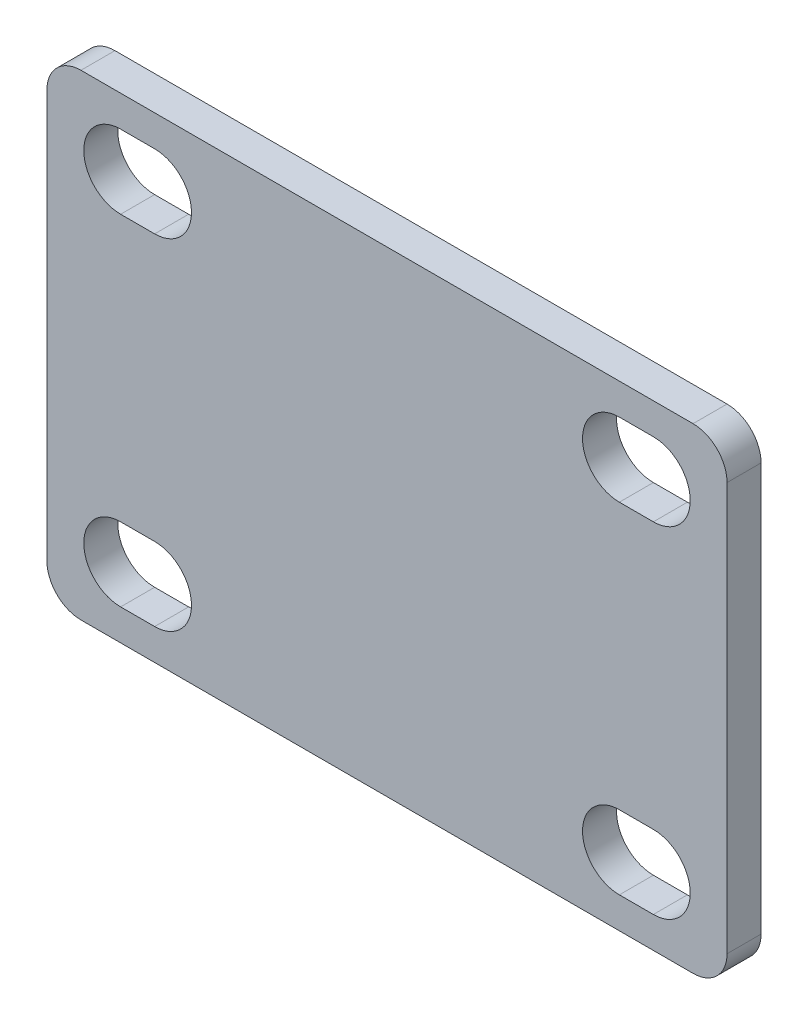
ISO-10303-21;
HEADER;
FILE_DESCRIPTION(('STEP AP214'),'2;1');
FILE_NAME('part.step','',(''),(''),'','','');
FILE_SCHEMA(('AUTOMOTIVE_DESIGN { 1 0 10303 214 1 1 1 1 }'));
ENDSEC;
DATA;
#1=APPLICATION_CONTEXT('core data for automotive mechanical design processes');
#2=APPLICATION_PROTOCOL_DEFINITION('international standard','automotive_design',2000,#1);
#3=PRODUCT_CONTEXT('',#1,'mechanical');
#4=PRODUCT('Part','Part','',(#3));
#5=PRODUCT_RELATED_PRODUCT_CATEGORY('part','',(#4));
#6=PRODUCT_DEFINITION_FORMATION('','',#4);
#7=PRODUCT_DEFINITION_CONTEXT('part definition',#1,'design');
#8=PRODUCT_DEFINITION('design','',#6,#7);
#9=PRODUCT_DEFINITION_SHAPE('','',#8);
#10=(LENGTH_UNIT() NAMED_UNIT(*) SI_UNIT(.MILLI.,.METRE.));
#11=(NAMED_UNIT(*) PLANE_ANGLE_UNIT() SI_UNIT($,.RADIAN.));
#12=(NAMED_UNIT(*) SI_UNIT($,.STERADIAN.) SOLID_ANGLE_UNIT());
#13=UNCERTAINTY_MEASURE_WITH_UNIT(LENGTH_MEASURE(1.E-05),#10,'distance_accuracy_value','');
#14=(GEOMETRIC_REPRESENTATION_CONTEXT(3) GLOBAL_UNCERTAINTY_ASSIGNED_CONTEXT((#13)) GLOBAL_UNIT_ASSIGNED_CONTEXT((#10,
#11,#12)) REPRESENTATION_CONTEXT('',''));
#15=CARTESIAN_POINT('',(0.,0.,0.));
#16=DIRECTION('',(0.,0.,1.));
#17=DIRECTION('',(1.,0.,0.));
#18=AXIS2_PLACEMENT_3D('',#15,#16,#17);
#19=CARTESIAN_POINT('',(-30.,21.,3.));
#20=DIRECTION('',(1.,0.,0.));
#21=DIRECTION('',(0.,1.,0.));
#22=AXIS2_PLACEMENT_3D('',#19,#20,#21);
#23=PLANE('',#22);
#24=DIRECTION('',(0.,-1.,0.));
#25=VECTOR('',#24,1.);
#26=CARTESIAN_POINT('',(-30.,21.,3.));
#27=LINE('',#26,#25);
#28=CARTESIAN_POINT('',(-30.,18.,3.));
#29=VERTEX_POINT('',#28);
#30=CARTESIAN_POINT('',(-30.,-18.,3.));
#31=VERTEX_POINT('',#30);
#32=EDGE_CURVE('E388',#29,#31,#27,.T.);
#33=ORIENTED_EDGE('',*,*,#32,.F.);
#34=DIRECTION('',(0.,0.,-1.));
#35=VECTOR('',#34,1.);
#36=CARTESIAN_POINT('',(-30.,18.,3.));
#37=LINE('',#36,#35);
#38=CARTESIAN_POINT('',(-30.,18.,0.));
#39=VERTEX_POINT('',#38);
#40=EDGE_CURVE('E419',#29,#39,#37,.T.);
#41=ORIENTED_EDGE('',*,*,#40,.T.);
#42=DIRECTION('',(0.,-1.,0.));
#43=VECTOR('',#42,1.);
#44=CARTESIAN_POINT('',(-30.,21.,0.));
#45=LINE('',#44,#43);
#46=CARTESIAN_POINT('',(-30.,-18.,0.));
#47=VERTEX_POINT('',#46);
#48=EDGE_CURVE('E378',#39,#47,#45,.T.);
#49=ORIENTED_EDGE('',*,*,#48,.T.);
#50=DIRECTION('',(0.,0.,-1.));
#51=VECTOR('',#50,1.);
#52=CARTESIAN_POINT('',(-30.,-18.,3.));
#53=LINE('',#52,#51);
#54=EDGE_CURVE('E403',#47,#31,#53,.F.);
#55=ORIENTED_EDGE('',*,*,#54,.T.);
#56=EDGE_LOOP('',(#33,#41,#49,#55));
#57=FACE_BOUND('',#56,.T.);
#58=ADVANCED_FACE('F45',(#57),#23,.F.);
#59=CARTESIAN_POINT('',(-30.,-21.,3.));
#60=DIRECTION('',(0.,1.,0.));
#61=DIRECTION('',(0.,0.,1.));
#62=AXIS2_PLACEMENT_3D('',#59,#60,#61);
#63=PLANE('',#62);
#64=DIRECTION('',(1.,0.,0.));
#65=VECTOR('',#64,1.);
#66=CARTESIAN_POINT('',(-30.,-21.,3.));
#67=LINE('',#66,#65);
#68=CARTESIAN_POINT('',(-27.,-21.,3.));
#69=VERTEX_POINT('',#68);
#70=CARTESIAN_POINT('',(27.,-21.,3.));
#71=VERTEX_POINT('',#70);
#72=EDGE_CURVE('E392',#69,#71,#67,.T.);
#73=ORIENTED_EDGE('',*,*,#72,.F.);
#74=DIRECTION('',(0.,0.,-1.));
#75=VECTOR('',#74,1.);
#76=CARTESIAN_POINT('',(-27.,-21.,3.));
#77=LINE('',#76,#75);
#78=CARTESIAN_POINT('',(-27.,-21.,0.));
#79=VERTEX_POINT('',#78);
#80=EDGE_CURVE('E456',#69,#79,#77,.T.);
#81=ORIENTED_EDGE('',*,*,#80,.T.);
#82=DIRECTION('',(1.,0.,0.));
#83=VECTOR('',#82,1.);
#84=CARTESIAN_POINT('',(-30.,-21.,0.));
#85=LINE('',#84,#83);
#86=CARTESIAN_POINT('',(27.,-21.,0.));
#87=VERTEX_POINT('',#86);
#88=EDGE_CURVE('E407',#79,#87,#85,.T.);
#89=ORIENTED_EDGE('',*,*,#88,.T.);
#90=DIRECTION('',(0.,0.,-1.));
#91=VECTOR('',#90,1.);
#92=CARTESIAN_POINT('',(27.,-21.,3.));
#93=LINE('',#92,#91);
#94=EDGE_CURVE('E453',#87,#71,#93,.F.);
#95=ORIENTED_EDGE('',*,*,#94,.T.);
#96=EDGE_LOOP('',(#73,#81,#89,#95));
#97=FACE_BOUND('',#96,.T.);
#98=ADVANCED_FACE('F464',(#97),#63,.F.);
#99=CARTESIAN_POINT('',(30.,21.,3.));
#100=DIRECTION('',(-1.,0.,0.));
#101=DIRECTION('',(0.,-1.,0.));
#102=AXIS2_PLACEMENT_3D('',#99,#100,#101);
#103=PLANE('',#102);
#104=DIRECTION('',(0.,1.,0.));
#105=VECTOR('',#104,1.);
#106=CARTESIAN_POINT('',(30.,21.,3.));
#107=LINE('',#106,#105);
#108=CARTESIAN_POINT('',(30.,-18.,3.));
#109=VERTEX_POINT('',#108);
#110=CARTESIAN_POINT('',(30.,18.,3.));
#111=VERTEX_POINT('',#110);
#112=EDGE_CURVE('E396',#109,#111,#107,.T.);
#113=ORIENTED_EDGE('',*,*,#112,.F.);
#114=DIRECTION('',(0.,0.,-1.));
#115=VECTOR('',#114,1.);
#116=CARTESIAN_POINT('',(30.,-18.,3.));
#117=LINE('',#116,#115);
#118=CARTESIAN_POINT('',(30.,-18.,0.));
#119=VERTEX_POINT('',#118);
#120=EDGE_CURVE('E11',#109,#119,#117,.T.);
#121=ORIENTED_EDGE('',*,*,#120,.T.);
#122=DIRECTION('',(0.,1.,0.));
#123=VECTOR('',#122,1.);
#124=CARTESIAN_POINT('',(30.,21.,0.));
#125=LINE('',#124,#123);
#126=CARTESIAN_POINT('',(30.,18.,0.));
#127=VERTEX_POINT('',#126);
#128=EDGE_CURVE('E411',#119,#127,#125,.T.);
#129=ORIENTED_EDGE('',*,*,#128,.T.);
#130=DIRECTION('',(0.,0.,-1.));
#131=VECTOR('',#130,1.);
#132=CARTESIAN_POINT('',(30.,18.,3.));
#133=LINE('',#132,#131);
#134=EDGE_CURVE('E54',#127,#111,#133,.F.);
#135=ORIENTED_EDGE('',*,*,#134,.T.);
#136=EDGE_LOOP('',(#113,#121,#129,#135));
#137=FACE_BOUND('',#136,.T.);
#138=ADVANCED_FACE('F475',(#137),#103,.F.);
#139=CARTESIAN_POINT('',(-30.,21.,3.));
#140=DIRECTION('',(0.,-1.,0.));
#141=DIRECTION('',(0.,0.,-1.));
#142=AXIS2_PLACEMENT_3D('',#139,#140,#141);
#143=PLANE('',#142);
#144=DIRECTION('',(-1.,0.,0.));
#145=VECTOR('',#144,1.);
#146=CARTESIAN_POINT('',(-30.,21.,0.));
#147=LINE('',#146,#145);
#148=CARTESIAN_POINT('',(27.,21.,0.));
#149=VERTEX_POINT('',#148);
#150=CARTESIAN_POINT('',(-27.,21.,0.));
#151=VERTEX_POINT('',#150);
#152=EDGE_CURVE('E393',#149,#151,#147,.T.);
#153=ORIENTED_EDGE('',*,*,#152,.T.);
#154=DIRECTION('',(0.,0.,-1.));
#155=VECTOR('',#154,1.);
#156=CARTESIAN_POINT('',(-27.,21.,3.));
#157=LINE('',#156,#155);
#158=CARTESIAN_POINT('',(-27.,21.,3.));
#159=VERTEX_POINT('',#158);
#160=EDGE_CURVE('E439',#151,#159,#157,.F.);
#161=ORIENTED_EDGE('',*,*,#160,.T.);
#162=DIRECTION('',(-1.,0.,0.));
#163=VECTOR('',#162,1.);
#164=CARTESIAN_POINT('',(-30.,21.,3.));
#165=LINE('',#164,#163);
#166=CARTESIAN_POINT('',(27.,21.,3.));
#167=VERTEX_POINT('',#166);
#168=EDGE_CURVE('E399',#167,#159,#165,.T.);
#169=ORIENTED_EDGE('',*,*,#168,.F.);
#170=DIRECTION('',(0.,0.,-1.));
#171=VECTOR('',#170,1.);
#172=CARTESIAN_POINT('',(27.,21.,3.));
#173=LINE('',#172,#171);
#174=EDGE_CURVE('E435',#167,#149,#173,.T.);
#175=ORIENTED_EDGE('',*,*,#174,.T.);
#176=EDGE_LOOP('',(#153,#161,#169,#175));
#177=FACE_BOUND('',#176,.T.);
#178=ADVANCED_FACE('F482',(#177),#143,.F.);
#179=CARTESIAN_POINT('',(0.,0.,3.));
#180=DIRECTION('',(0.,0.,1.));
#181=DIRECTION('',(1.,0.,0.));
#182=AXIS2_PLACEMENT_3D('',#179,#180,#181);
#183=PLANE('',#182);
#184=CARTESIAN_POINT('',(-23.5,-15.,3.));
#185=DIRECTION('',(0.,0.,1.));
#186=DIRECTION('',(-1.,0.,0.));
#187=AXIS2_PLACEMENT_3D('',#184,#185,#186);
#188=CIRCLE('',#187,3.25);
#189=CARTESIAN_POINT('',(-23.5,-11.75,3.));
#190=VERTEX_POINT('',#189);
#191=CARTESIAN_POINT('',(-23.5,-18.25,3.));
#192=VERTEX_POINT('',#191);
#193=EDGE_CURVE('E274',#190,#192,#188,.T.);
#194=ORIENTED_EDGE('',*,*,#193,.F.);
#195=DIRECTION('',(-1.,0.,0.));
#196=VECTOR('',#195,1.);
#197=CARTESIAN_POINT('',(-23.5,-11.75,3.));
#198=LINE('',#197,#196);
#199=CARTESIAN_POINT('',(-20.5,-11.75,3.));
#200=VERTEX_POINT('',#199);
#201=EDGE_CURVE('E318',#200,#190,#198,.T.);
#202=ORIENTED_EDGE('',*,*,#201,.F.);
#203=CARTESIAN_POINT('',(-20.5,-15.,3.));
#204=DIRECTION('',(0.,0.,1.));
#205=DIRECTION('',(-1.,0.,0.));
#206=AXIS2_PLACEMENT_3D('',#203,#204,#205);
#207=CIRCLE('',#206,3.25);
#208=CARTESIAN_POINT('',(-20.5,-18.25,3.));
#209=VERTEX_POINT('',#208);
#210=EDGE_CURVE('E322',#209,#200,#207,.T.);
#211=ORIENTED_EDGE('',*,*,#210,.F.);
#212=DIRECTION('',(1.,0.,0.));
#213=VECTOR('',#212,1.);
#214=CARTESIAN_POINT('',(-23.5,-18.25,3.));
#215=LINE('',#214,#213);
#216=EDGE_CURVE('E327',#192,#209,#215,.T.);
#217=ORIENTED_EDGE('',*,*,#216,.F.);
#218=EDGE_LOOP('',(#194,#202,#211,#217));
#219=FACE_BOUND('',#218,.T.);
#220=CARTESIAN_POINT('',(20.5,-15.,3.));
#221=DIRECTION('',(0.,0.,1.));
#222=DIRECTION('',(-1.,0.,0.));
#223=AXIS2_PLACEMENT_3D('',#220,#221,#222);
#224=CIRCLE('',#223,3.25);
#225=CARTESIAN_POINT('',(20.5,-11.75,3.));
#226=VERTEX_POINT('',#225);
#227=CARTESIAN_POINT('',(20.5,-18.25,3.));
#228=VERTEX_POINT('',#227);
#229=EDGE_CURVE('E220',#226,#228,#224,.T.);
#230=ORIENTED_EDGE('',*,*,#229,.F.);
#231=DIRECTION('',(-1.,0.,0.));
#232=VECTOR('',#231,1.);
#233=CARTESIAN_POINT('',(20.5,-11.75,3.));
#234=LINE('',#233,#232);
#235=CARTESIAN_POINT('',(23.5,-11.75,3.));
#236=VERTEX_POINT('',#235);
#237=EDGE_CURVE('E275',#236,#226,#234,.T.);
#238=ORIENTED_EDGE('',*,*,#237,.F.);
#239=CARTESIAN_POINT('',(23.5,-15.,3.));
#240=DIRECTION('',(0.,0.,1.));
#241=DIRECTION('',(-1.,0.,0.));
#242=AXIS2_PLACEMENT_3D('',#239,#240,#241);
#243=CIRCLE('',#242,3.25);
#244=CARTESIAN_POINT('',(23.5,-18.25,3.));
#245=VERTEX_POINT('',#244);
#246=EDGE_CURVE('E279',#245,#236,#243,.T.);
#247=ORIENTED_EDGE('',*,*,#246,.F.);
#248=DIRECTION('',(1.,0.,0.));
#249=VECTOR('',#248,1.);
#250=CARTESIAN_POINT('',(20.5,-18.25,3.));
#251=LINE('',#250,#249);
#252=EDGE_CURVE('E284',#228,#245,#251,.T.);
#253=ORIENTED_EDGE('',*,*,#252,.F.);
#254=EDGE_LOOP('',(#230,#238,#247,#253));
#255=FACE_BOUND('',#254,.T.);
#256=CARTESIAN_POINT('',(20.5,15.,3.));
#257=DIRECTION('',(0.,0.,1.));
#258=DIRECTION('',(1.,0.,0.));
#259=AXIS2_PLACEMENT_3D('',#256,#257,#258);
#260=CIRCLE('',#259,3.25);
#261=CARTESIAN_POINT('',(20.5,18.25,3.));
#262=VERTEX_POINT('',#261);
#263=CARTESIAN_POINT('',(20.5,11.75,3.));
#264=VERTEX_POINT('',#263);
#265=EDGE_CURVE('E211',#262,#264,#260,.T.);
#266=ORIENTED_EDGE('',*,*,#265,.F.);
#267=DIRECTION('',(-1.,0.,0.));
#268=VECTOR('',#267,1.);
#269=CARTESIAN_POINT('',(20.5,18.25,3.));
#270=LINE('',#269,#268);
#271=CARTESIAN_POINT('',(23.5,18.25,3.));
#272=VERTEX_POINT('',#271);
#273=EDGE_CURVE('E223',#272,#262,#270,.T.);
#274=ORIENTED_EDGE('',*,*,#273,.F.);
#275=CARTESIAN_POINT('',(23.5,15.,3.));
#276=DIRECTION('',(0.,0.,1.));
#277=DIRECTION('',(1.,0.,0.));
#278=AXIS2_PLACEMENT_3D('',#275,#276,#277);
#279=CIRCLE('',#278,3.25);
#280=CARTESIAN_POINT('',(23.5,11.75,3.));
#281=VERTEX_POINT('',#280);
#282=EDGE_CURVE('E229',#281,#272,#279,.T.);
#283=ORIENTED_EDGE('',*,*,#282,.F.);
#284=DIRECTION('',(1.,0.,0.));
#285=VECTOR('',#284,1.);
#286=CARTESIAN_POINT('',(20.5,11.75,3.));
#287=LINE('',#286,#285);
#288=EDGE_CURVE('E235',#264,#281,#287,.T.);
#289=ORIENTED_EDGE('',*,*,#288,.F.);
#290=EDGE_LOOP('',(#266,#274,#283,#289));
#291=FACE_BOUND('',#290,.T.);
#292=CARTESIAN_POINT('',(-23.5,15.,3.));
#293=DIRECTION('',(0.,0.,1.));
#294=DIRECTION('',(1.,0.,0.));
#295=AXIS2_PLACEMENT_3D('',#292,#293,#294);
#296=CIRCLE('',#295,3.25);
#297=CARTESIAN_POINT('',(-23.5,18.25,3.));
#298=VERTEX_POINT('',#297);
#299=CARTESIAN_POINT('',(-23.5,11.75,3.));
#300=VERTEX_POINT('',#299);
#301=EDGE_CURVE('E237',#298,#300,#296,.T.);
#302=ORIENTED_EDGE('',*,*,#301,.F.);
#303=DIRECTION('',(-1.,0.,0.));
#304=VECTOR('',#303,1.);
#305=CARTESIAN_POINT('',(-23.5,18.25,3.));
#306=LINE('',#305,#304);
#307=CARTESIAN_POINT('',(-20.5,18.25,3.));
#308=VERTEX_POINT('',#307);
#309=EDGE_CURVE('E352',#308,#298,#306,.T.);
#310=ORIENTED_EDGE('',*,*,#309,.F.);
#311=CARTESIAN_POINT('',(-20.5,15.,3.));
#312=DIRECTION('',(0.,0.,1.));
#313=DIRECTION('',(1.,0.,0.));
#314=AXIS2_PLACEMENT_3D('',#311,#312,#313);
#315=CIRCLE('',#314,3.25);
#316=CARTESIAN_POINT('',(-20.5,11.75,3.));
#317=VERTEX_POINT('',#316);
#318=EDGE_CURVE('E368',#317,#308,#315,.T.);
#319=ORIENTED_EDGE('',*,*,#318,.F.);
#320=DIRECTION('',(1.,0.,0.));
#321=VECTOR('',#320,1.);
#322=CARTESIAN_POINT('',(-23.5,11.75,3.));
#323=LINE('',#322,#321);
#324=EDGE_CURVE('E241',#300,#317,#323,.T.);
#325=ORIENTED_EDGE('',*,*,#324,.F.);
#326=EDGE_LOOP('',(#302,#310,#319,#325));
#327=FACE_BOUND('',#326,.T.);
#328=ORIENTED_EDGE('',*,*,#168,.T.);
#329=CARTESIAN_POINT('',(-27.,18.,3.));
#330=DIRECTION('',(0.,0.,1.));
#331=DIRECTION('',(1.,0.,0.));
#332=AXIS2_PLACEMENT_3D('',#329,#330,#331);
#333=CIRCLE('',#332,3.);
#334=EDGE_CURVE('E450',#159,#29,#333,.T.);
#335=ORIENTED_EDGE('',*,*,#334,.T.);
#336=ORIENTED_EDGE('',*,*,#32,.T.);
#337=CARTESIAN_POINT('',(-27.,-18.,3.));
#338=DIRECTION('',(0.,0.,1.));
#339=DIRECTION('',(1.,0.,0.));
#340=AXIS2_PLACEMENT_3D('',#337,#338,#339);
#341=CIRCLE('',#340,3.);
#342=EDGE_CURVE('E447',#31,#69,#341,.T.);
#343=ORIENTED_EDGE('',*,*,#342,.T.);
#344=ORIENTED_EDGE('',*,*,#72,.T.);
#345=CARTESIAN_POINT('',(27.,-18.,3.));
#346=DIRECTION('',(0.,0.,1.));
#347=DIRECTION('',(1.,0.,0.));
#348=AXIS2_PLACEMENT_3D('',#345,#346,#347);
#349=CIRCLE('',#348,3.);
#350=EDGE_CURVE('E67',#71,#109,#349,.T.);
#351=ORIENTED_EDGE('',*,*,#350,.T.);
#352=ORIENTED_EDGE('',*,*,#112,.T.);
#353=CARTESIAN_POINT('',(27.,18.,3.));
#354=DIRECTION('',(0.,0.,1.));
#355=DIRECTION('',(1.,0.,0.));
#356=AXIS2_PLACEMENT_3D('',#353,#354,#355);
#357=CIRCLE('',#356,3.);
#358=EDGE_CURVE('E442',#111,#167,#357,.T.);
#359=ORIENTED_EDGE('',*,*,#358,.T.);
#360=EDGE_LOOP('',(#328,#335,#336,#343,#344,#351,#352,#359));
#361=FACE_BOUND('',#360,.T.);
#362=ADVANCED_FACE('F232',(#219,#255,#291,#327,#361),#183,.T.);
#363=CARTESIAN_POINT('',(0.,0.,0.));
#364=DIRECTION('',(0.,0.,1.));
#365=DIRECTION('',(1.,0.,0.));
#366=AXIS2_PLACEMENT_3D('',#363,#364,#365);
#367=PLANE('',#366);
#368=DIRECTION('',(-1.,0.,0.));
#369=VECTOR('',#368,1.);
#370=CARTESIAN_POINT('',(-23.5,-11.75,0.));
#371=LINE('',#370,#369);
#372=CARTESIAN_POINT('',(-20.5,-11.75,0.));
#373=VERTEX_POINT('',#372);
#374=CARTESIAN_POINT('',(-23.5,-11.75,0.));
#375=VERTEX_POINT('',#374);
#376=EDGE_CURVE('E308',#373,#375,#371,.T.);
#377=ORIENTED_EDGE('',*,*,#376,.T.);
#378=CARTESIAN_POINT('',(-23.5,-15.,0.));
#379=DIRECTION('',(0.,0.,1.));
#380=DIRECTION('',(-1.,0.,0.));
#381=AXIS2_PLACEMENT_3D('',#378,#379,#380);
#382=CIRCLE('',#381,3.25);
#383=CARTESIAN_POINT('',(-23.5,-18.25,0.));
#384=VERTEX_POINT('',#383);
#385=EDGE_CURVE('E323',#375,#384,#382,.T.);
#386=ORIENTED_EDGE('',*,*,#385,.T.);
#387=DIRECTION('',(1.,0.,0.));
#388=VECTOR('',#387,1.);
#389=CARTESIAN_POINT('',(-23.5,-18.25,0.));
#390=LINE('',#389,#388);
#391=CARTESIAN_POINT('',(-20.5,-18.25,0.));
#392=VERTEX_POINT('',#391);
#393=EDGE_CURVE('E340',#384,#392,#390,.T.);
#394=ORIENTED_EDGE('',*,*,#393,.T.);
#395=CARTESIAN_POINT('',(-20.5,-15.,0.));
#396=DIRECTION('',(0.,0.,1.));
#397=DIRECTION('',(-1.,0.,0.));
#398=AXIS2_PLACEMENT_3D('',#395,#396,#397);
#399=CIRCLE('',#398,3.25);
#400=EDGE_CURVE('E336',#392,#373,#399,.T.);
#401=ORIENTED_EDGE('',*,*,#400,.T.);
#402=EDGE_LOOP('',(#377,#386,#394,#401));
#403=FACE_BOUND('',#402,.T.);
#404=DIRECTION('',(-1.,0.,0.));
#405=VECTOR('',#404,1.);
#406=CARTESIAN_POINT('',(20.5,-11.75,0.));
#407=LINE('',#406,#405);
#408=CARTESIAN_POINT('',(23.5,-11.75,0.));
#409=VERTEX_POINT('',#408);
#410=CARTESIAN_POINT('',(20.5,-11.75,0.));
#411=VERTEX_POINT('',#410);
#412=EDGE_CURVE('E264',#409,#411,#407,.T.);
#413=ORIENTED_EDGE('',*,*,#412,.T.);
#414=CARTESIAN_POINT('',(20.5,-15.,0.));
#415=DIRECTION('',(0.,0.,1.));
#416=DIRECTION('',(-1.,0.,0.));
#417=AXIS2_PLACEMENT_3D('',#414,#415,#416);
#418=CIRCLE('',#417,3.25);
#419=CARTESIAN_POINT('',(20.5,-18.25,0.));
#420=VERTEX_POINT('',#419);
#421=EDGE_CURVE('E280',#411,#420,#418,.T.);
#422=ORIENTED_EDGE('',*,*,#421,.T.);
#423=DIRECTION('',(1.,0.,0.));
#424=VECTOR('',#423,1.);
#425=CARTESIAN_POINT('',(20.5,-18.25,0.));
#426=LINE('',#425,#424);
#427=CARTESIAN_POINT('',(23.5,-18.25,0.));
#428=VERTEX_POINT('',#427);
#429=EDGE_CURVE('E297',#420,#428,#426,.T.);
#430=ORIENTED_EDGE('',*,*,#429,.T.);
#431=CARTESIAN_POINT('',(23.5,-15.,0.));
#432=DIRECTION('',(0.,0.,1.));
#433=DIRECTION('',(-1.,0.,0.));
#434=AXIS2_PLACEMENT_3D('',#431,#432,#433);
#435=CIRCLE('',#434,3.25);
#436=EDGE_CURVE('E293',#428,#409,#435,.T.);
#437=ORIENTED_EDGE('',*,*,#436,.T.);
#438=EDGE_LOOP('',(#413,#422,#430,#437));
#439=FACE_BOUND('',#438,.T.);
#440=DIRECTION('',(-1.,0.,0.));
#441=VECTOR('',#440,1.);
#442=CARTESIAN_POINT('',(20.5,18.25,0.));
#443=LINE('',#442,#441);
#444=CARTESIAN_POINT('',(23.5,18.25,0.));
#445=VERTEX_POINT('',#444);
#446=CARTESIAN_POINT('',(20.5,18.25,0.));
#447=VERTEX_POINT('',#446);
#448=EDGE_CURVE('E246',#445,#447,#443,.T.);
#449=ORIENTED_EDGE('',*,*,#448,.T.);
#450=CARTESIAN_POINT('',(20.5,15.,0.));
#451=DIRECTION('',(0.,0.,1.));
#452=DIRECTION('',(1.,0.,0.));
#453=AXIS2_PLACEMENT_3D('',#450,#451,#452);
#454=CIRCLE('',#453,3.25);
#455=CARTESIAN_POINT('',(20.5,11.75,0.));
#456=VERTEX_POINT('',#455);
#457=EDGE_CURVE('E214',#447,#456,#454,.T.);
#458=ORIENTED_EDGE('',*,*,#457,.T.);
#459=DIRECTION('',(1.,0.,0.));
#460=VECTOR('',#459,1.);
#461=CARTESIAN_POINT('',(20.5,11.75,0.));
#462=LINE('',#461,#460);
#463=CARTESIAN_POINT('',(23.5,11.75,0.));
#464=VERTEX_POINT('',#463);
#465=EDGE_CURVE('E254',#456,#464,#462,.T.);
#466=ORIENTED_EDGE('',*,*,#465,.T.);
#467=CARTESIAN_POINT('',(23.5,15.,0.));
#468=DIRECTION('',(0.,0.,1.));
#469=DIRECTION('',(1.,0.,0.));
#470=AXIS2_PLACEMENT_3D('',#467,#468,#469);
#471=CIRCLE('',#470,3.25);
#472=EDGE_CURVE('E249',#464,#445,#471,.T.);
#473=ORIENTED_EDGE('',*,*,#472,.T.);
#474=EDGE_LOOP('',(#449,#458,#466,#473));
#475=FACE_BOUND('',#474,.T.);
#476=DIRECTION('',(-1.,0.,0.));
#477=VECTOR('',#476,1.);
#478=CARTESIAN_POINT('',(-23.5,18.25,0.));
#479=LINE('',#478,#477);
#480=CARTESIAN_POINT('',(-20.5,18.25,0.));
#481=VERTEX_POINT('',#480);
#482=CARTESIAN_POINT('',(-23.5,18.25,0.));
#483=VERTEX_POINT('',#482);
#484=EDGE_CURVE('E360',#481,#483,#479,.T.);
#485=ORIENTED_EDGE('',*,*,#484,.T.);
#486=CARTESIAN_POINT('',(-23.5,15.,0.));
#487=DIRECTION('',(0.,0.,1.));
#488=DIRECTION('',(1.,0.,0.));
#489=AXIS2_PLACEMENT_3D('',#486,#487,#488);
#490=CIRCLE('',#489,3.25);
#491=CARTESIAN_POINT('',(-23.5,11.75,0.));
#492=VERTEX_POINT('',#491);
#493=EDGE_CURVE('E347',#483,#492,#490,.T.);
#494=ORIENTED_EDGE('',*,*,#493,.T.);
#495=DIRECTION('',(1.,0.,0.));
#496=VECTOR('',#495,1.);
#497=CARTESIAN_POINT('',(-23.5,11.75,0.));
#498=LINE('',#497,#496);
#499=CARTESIAN_POINT('',(-20.5,11.75,0.));
#500=VERTEX_POINT('',#499);
#501=EDGE_CURVE('E351',#492,#500,#498,.T.);
#502=ORIENTED_EDGE('',*,*,#501,.T.);
#503=CARTESIAN_POINT('',(-20.5,15.,0.));
#504=DIRECTION('',(0.,0.,1.));
#505=DIRECTION('',(1.,0.,0.));
#506=AXIS2_PLACEMENT_3D('',#503,#504,#505);
#507=CIRCLE('',#506,3.25);
#508=EDGE_CURVE('E356',#500,#481,#507,.T.);
#509=ORIENTED_EDGE('',*,*,#508,.T.);
#510=EDGE_LOOP('',(#485,#494,#502,#509));
#511=FACE_BOUND('',#510,.T.);
#512=ORIENTED_EDGE('',*,*,#48,.F.);
#513=CARTESIAN_POINT('',(-27.,18.,0.));
#514=DIRECTION('',(0.,0.,1.));
#515=DIRECTION('',(1.,0.,0.));
#516=AXIS2_PLACEMENT_3D('',#513,#514,#515);
#517=CIRCLE('',#516,3.);
#518=EDGE_CURVE('E432',#39,#151,#517,.F.);
#519=ORIENTED_EDGE('',*,*,#518,.T.);
#520=ORIENTED_EDGE('',*,*,#152,.F.);
#521=CARTESIAN_POINT('',(27.,18.,0.));
#522=DIRECTION('',(0.,0.,1.));
#523=DIRECTION('',(1.,0.,0.));
#524=AXIS2_PLACEMENT_3D('',#521,#522,#523);
#525=CIRCLE('',#524,3.);
#526=EDGE_CURVE('E423',#149,#127,#525,.F.);
#527=ORIENTED_EDGE('',*,*,#526,.T.);
#528=ORIENTED_EDGE('',*,*,#128,.F.);
#529=CARTESIAN_POINT('',(27.,-18.,0.));
#530=DIRECTION('',(0.,0.,1.));
#531=DIRECTION('',(1.,0.,0.));
#532=AXIS2_PLACEMENT_3D('',#529,#530,#531);
#533=CIRCLE('',#532,3.);
#534=EDGE_CURVE('E426',#119,#87,#533,.F.);
#535=ORIENTED_EDGE('',*,*,#534,.T.);
#536=ORIENTED_EDGE('',*,*,#88,.F.);
#537=CARTESIAN_POINT('',(-27.,-18.,0.));
#538=DIRECTION('',(0.,0.,1.));
#539=DIRECTION('',(1.,0.,0.));
#540=AXIS2_PLACEMENT_3D('',#537,#538,#539);
#541=CIRCLE('',#540,3.);
#542=EDGE_CURVE('E429',#79,#47,#541,.F.);
#543=ORIENTED_EDGE('',*,*,#542,.T.);
#544=EDGE_LOOP('',(#512,#519,#520,#527,#528,#535,#536,#543));
#545=FACE_BOUND('',#544,.T.);
#546=ADVANCED_FACE('F470',(#403,#439,#475,#511,#545),#367,.F.);
#547=CARTESIAN_POINT('',(-23.5,15.,0.));
#548=DIRECTION('',(0.,0.,1.));
#549=DIRECTION('',(1.,0.,0.));
#550=AXIS2_PLACEMENT_3D('',#547,#548,#549);
#551=CYLINDRICAL_SURFACE('',#550,3.25);
#552=ORIENTED_EDGE('',*,*,#301,.T.);
#553=DIRECTION('',(0.,0.,1.));
#554=VECTOR('',#553,1.);
#555=CARTESIAN_POINT('',(-23.5,11.75,0.));
#556=LINE('',#555,#554);
#557=EDGE_CURVE('E363',#492,#300,#556,.T.);
#558=ORIENTED_EDGE('',*,*,#557,.F.);
#559=ORIENTED_EDGE('',*,*,#493,.F.);
#560=DIRECTION('',(0.,0.,1.));
#561=VECTOR('',#560,1.);
#562=CARTESIAN_POINT('',(-23.5,18.25,0.));
#563=LINE('',#562,#561);
#564=EDGE_CURVE('E375',#483,#298,#563,.T.);
#565=ORIENTED_EDGE('',*,*,#564,.T.);
#566=EDGE_LOOP('',(#552,#558,#559,#565));
#567=FACE_BOUND('',#566,.T.);
#568=ADVANCED_FACE('F514',(#567),#551,.F.);
#569=CARTESIAN_POINT('',(-23.5,18.25,0.));
#570=DIRECTION('',(0.,1.,0.));
#571=DIRECTION('',(0.,0.,1.));
#572=AXIS2_PLACEMENT_3D('',#569,#570,#571);
#573=PLANE('',#572);
#574=ORIENTED_EDGE('',*,*,#309,.T.);
#575=ORIENTED_EDGE('',*,*,#564,.F.);
#576=ORIENTED_EDGE('',*,*,#484,.F.);
#577=DIRECTION('',(0.,0.,1.));
#578=VECTOR('',#577,1.);
#579=CARTESIAN_POINT('',(-20.5,18.25,0.));
#580=LINE('',#579,#578);
#581=EDGE_CURVE('E379',#481,#308,#580,.T.);
#582=ORIENTED_EDGE('',*,*,#581,.T.);
#583=EDGE_LOOP('',(#574,#575,#576,#582));
#584=FACE_BOUND('',#583,.T.);
#585=ADVANCED_FACE('F521',(#584),#573,.F.);
#586=CARTESIAN_POINT('',(-20.5,15.,0.));
#587=DIRECTION('',(0.,0.,1.));
#588=DIRECTION('',(1.,0.,0.));
#589=AXIS2_PLACEMENT_3D('',#586,#587,#588);
#590=CYLINDRICAL_SURFACE('',#589,3.25);
#591=ORIENTED_EDGE('',*,*,#318,.T.);
#592=ORIENTED_EDGE('',*,*,#581,.F.);
#593=ORIENTED_EDGE('',*,*,#508,.F.);
#594=DIRECTION('',(0.,0.,1.));
#595=VECTOR('',#594,1.);
#596=CARTESIAN_POINT('',(-20.5,11.75,0.));
#597=LINE('',#596,#595);
#598=EDGE_CURVE('E382',#500,#317,#597,.T.);
#599=ORIENTED_EDGE('',*,*,#598,.T.);
#600=EDGE_LOOP('',(#591,#592,#593,#599));
#601=FACE_BOUND('',#600,.T.);
#602=ADVANCED_FACE('F526',(#601),#590,.F.);
#603=CARTESIAN_POINT('',(-23.5,11.75,0.));
#604=DIRECTION('',(0.,-1.,0.));
#605=DIRECTION('',(0.,0.,-1.));
#606=AXIS2_PLACEMENT_3D('',#603,#604,#605);
#607=PLANE('',#606);
#608=ORIENTED_EDGE('',*,*,#324,.T.);
#609=ORIENTED_EDGE('',*,*,#598,.F.);
#610=ORIENTED_EDGE('',*,*,#501,.F.);
#611=ORIENTED_EDGE('',*,*,#557,.T.);
#612=EDGE_LOOP('',(#608,#609,#610,#611));
#613=FACE_BOUND('',#612,.T.);
#614=ADVANCED_FACE('F523',(#613),#607,.F.);
#615=CARTESIAN_POINT('',(20.5,15.,0.));
#616=DIRECTION('',(0.,0.,1.));
#617=DIRECTION('',(1.,0.,0.));
#618=AXIS2_PLACEMENT_3D('',#615,#616,#617);
#619=CYLINDRICAL_SURFACE('',#618,3.25);
#620=ORIENTED_EDGE('',*,*,#265,.T.);
#621=DIRECTION('',(0.,0.,1.));
#622=VECTOR('',#621,1.);
#623=CARTESIAN_POINT('',(20.5,11.75,0.));
#624=LINE('',#623,#622);
#625=EDGE_CURVE('E250',#456,#264,#624,.T.);
#626=ORIENTED_EDGE('',*,*,#625,.F.);
#627=ORIENTED_EDGE('',*,*,#457,.F.);
#628=DIRECTION('',(0.,0.,1.));
#629=VECTOR('',#628,1.);
#630=CARTESIAN_POINT('',(20.5,18.25,0.));
#631=LINE('',#630,#629);
#632=EDGE_CURVE('E207',#447,#262,#631,.T.);
#633=ORIENTED_EDGE('',*,*,#632,.T.);
#634=EDGE_LOOP('',(#620,#626,#627,#633));
#635=FACE_BOUND('',#634,.T.);
#636=ADVANCED_FACE('F209',(#635),#619,.F.);
#637=CARTESIAN_POINT('',(20.5,18.25,0.));
#638=DIRECTION('',(0.,1.,0.));
#639=DIRECTION('',(0.,0.,1.));
#640=AXIS2_PLACEMENT_3D('',#637,#638,#639);
#641=PLANE('',#640);
#642=ORIENTED_EDGE('',*,*,#273,.T.);
#643=ORIENTED_EDGE('',*,*,#632,.F.);
#644=ORIENTED_EDGE('',*,*,#448,.F.);
#645=DIRECTION('',(0.,0.,1.));
#646=VECTOR('',#645,1.);
#647=CARTESIAN_POINT('',(23.5,18.25,0.));
#648=LINE('',#647,#646);
#649=EDGE_CURVE('E219',#445,#272,#648,.T.);
#650=ORIENTED_EDGE('',*,*,#649,.T.);
#651=EDGE_LOOP('',(#642,#643,#644,#650));
#652=FACE_BOUND('',#651,.T.);
#653=ADVANCED_FACE('F224',(#652),#641,.F.);
#654=CARTESIAN_POINT('',(23.5,15.,0.));
#655=DIRECTION('',(0.,0.,1.));
#656=DIRECTION('',(1.,0.,0.));
#657=AXIS2_PLACEMENT_3D('',#654,#655,#656);
#658=CYLINDRICAL_SURFACE('',#657,3.25);
#659=ORIENTED_EDGE('',*,*,#282,.T.);
#660=ORIENTED_EDGE('',*,*,#649,.F.);
#661=ORIENTED_EDGE('',*,*,#472,.F.);
#662=DIRECTION('',(0.,0.,1.));
#663=VECTOR('',#662,1.);
#664=CARTESIAN_POINT('',(23.5,11.75,0.));
#665=LINE('',#664,#663);
#666=EDGE_CURVE('E730',#464,#281,#665,.T.);
#667=ORIENTED_EDGE('',*,*,#666,.T.);
#668=EDGE_LOOP('',(#659,#660,#661,#667));
#669=FACE_BOUND('',#668,.T.);
#670=ADVANCED_FACE('F567',(#669),#658,.F.);
#671=CARTESIAN_POINT('',(20.5,11.75,0.));
#672=DIRECTION('',(0.,-1.,0.));
#673=DIRECTION('',(0.,0.,-1.));
#674=AXIS2_PLACEMENT_3D('',#671,#672,#673);
#675=PLANE('',#674);
#676=ORIENTED_EDGE('',*,*,#288,.T.);
#677=ORIENTED_EDGE('',*,*,#666,.F.);
#678=ORIENTED_EDGE('',*,*,#465,.F.);
#679=ORIENTED_EDGE('',*,*,#625,.T.);
#680=EDGE_LOOP('',(#676,#677,#678,#679));
#681=FACE_BOUND('',#680,.T.);
#682=ADVANCED_FACE('F563',(#681),#675,.F.);
#683=CARTESIAN_POINT('',(20.5,-15.,0.));
#684=DIRECTION('',(0.,0.,1.));
#685=DIRECTION('',(1.,0.,0.));
#686=AXIS2_PLACEMENT_3D('',#683,#684,#685);
#687=CYLINDRICAL_SURFACE('',#686,3.25);
#688=ORIENTED_EDGE('',*,*,#229,.T.);
#689=DIRECTION('',(0.,0.,1.));
#690=VECTOR('',#689,1.);
#691=CARTESIAN_POINT('',(20.5,-18.25,0.));
#692=LINE('',#691,#690);
#693=EDGE_CURVE('E260',#420,#228,#692,.T.);
#694=ORIENTED_EDGE('',*,*,#693,.F.);
#695=ORIENTED_EDGE('',*,*,#421,.F.);
#696=DIRECTION('',(0.,0.,1.));
#697=VECTOR('',#696,1.);
#698=CARTESIAN_POINT('',(20.5,-11.75,0.));
#699=LINE('',#698,#697);
#700=EDGE_CURVE('E271',#411,#226,#699,.T.);
#701=ORIENTED_EDGE('',*,*,#700,.T.);
#702=EDGE_LOOP('',(#688,#694,#695,#701));
#703=FACE_BOUND('',#702,.T.);
#704=ADVANCED_FACE('F553',(#703),#687,.F.);
#705=CARTESIAN_POINT('',(20.5,-11.75,0.));
#706=DIRECTION('',(0.,1.,0.));
#707=DIRECTION('',(0.,0.,1.));
#708=AXIS2_PLACEMENT_3D('',#705,#706,#707);
#709=PLANE('',#708);
#710=ORIENTED_EDGE('',*,*,#237,.T.);
#711=ORIENTED_EDGE('',*,*,#700,.F.);
#712=ORIENTED_EDGE('',*,*,#412,.F.);
#713=DIRECTION('',(0.,0.,1.));
#714=VECTOR('',#713,1.);
#715=CARTESIAN_POINT('',(23.5,-11.75,0.));
#716=LINE('',#715,#714);
#717=EDGE_CURVE('E268',#409,#236,#716,.T.);
#718=ORIENTED_EDGE('',*,*,#717,.T.);
#719=EDGE_LOOP('',(#710,#711,#712,#718));
#720=FACE_BOUND('',#719,.T.);
#721=ADVANCED_FACE('F549',(#720),#709,.F.);
#722=CARTESIAN_POINT('',(23.5,-15.,0.));
#723=DIRECTION('',(0.,0.,1.));
#724=DIRECTION('',(1.,0.,0.));
#725=AXIS2_PLACEMENT_3D('',#722,#723,#724);
#726=CYLINDRICAL_SURFACE('',#725,3.25);
#727=ORIENTED_EDGE('',*,*,#246,.T.);
#728=ORIENTED_EDGE('',*,*,#717,.F.);
#729=ORIENTED_EDGE('',*,*,#436,.F.);
#730=DIRECTION('',(0.,0.,1.));
#731=VECTOR('',#730,1.);
#732=CARTESIAN_POINT('',(23.5,-18.25,0.));
#733=LINE('',#732,#731);
#734=EDGE_CURVE('E265',#428,#245,#733,.T.);
#735=ORIENTED_EDGE('',*,*,#734,.T.);
#736=EDGE_LOOP('',(#727,#728,#729,#735));
#737=FACE_BOUND('',#736,.T.);
#738=ADVANCED_FACE('F552',(#737),#726,.F.);
#739=CARTESIAN_POINT('',(20.5,-18.25,0.));
#740=DIRECTION('',(0.,-1.,0.));
#741=DIRECTION('',(0.,0.,-1.));
#742=AXIS2_PLACEMENT_3D('',#739,#740,#741);
#743=PLANE('',#742);
#744=ORIENTED_EDGE('',*,*,#252,.T.);
#745=ORIENTED_EDGE('',*,*,#734,.F.);
#746=ORIENTED_EDGE('',*,*,#429,.F.);
#747=ORIENTED_EDGE('',*,*,#693,.T.);
#748=EDGE_LOOP('',(#744,#745,#746,#747));
#749=FACE_BOUND('',#748,.T.);
#750=ADVANCED_FACE('F547',(#749),#743,.F.);
#751=CARTESIAN_POINT('',(-23.5,-15.,0.));
#752=DIRECTION('',(0.,0.,1.));
#753=DIRECTION('',(1.,0.,0.));
#754=AXIS2_PLACEMENT_3D('',#751,#752,#753);
#755=CYLINDRICAL_SURFACE('',#754,3.25);
#756=ORIENTED_EDGE('',*,*,#193,.T.);
#757=DIRECTION('',(0.,0.,1.));
#758=VECTOR('',#757,1.);
#759=CARTESIAN_POINT('',(-23.5,-18.25,0.));
#760=LINE('',#759,#758);
#761=EDGE_CURVE('E304',#384,#192,#760,.T.);
#762=ORIENTED_EDGE('',*,*,#761,.F.);
#763=ORIENTED_EDGE('',*,*,#385,.F.);
#764=DIRECTION('',(0.,0.,1.));
#765=VECTOR('',#764,1.);
#766=CARTESIAN_POINT('',(-23.5,-11.75,0.));
#767=LINE('',#766,#765);
#768=EDGE_CURVE('E315',#375,#190,#767,.T.);
#769=ORIENTED_EDGE('',*,*,#768,.T.);
#770=EDGE_LOOP('',(#756,#762,#763,#769));
#771=FACE_BOUND('',#770,.T.);
#772=ADVANCED_FACE('F538',(#771),#755,.F.);
#773=CARTESIAN_POINT('',(-23.5,-11.75,0.));
#774=DIRECTION('',(0.,1.,0.));
#775=DIRECTION('',(0.,0.,1.));
#776=AXIS2_PLACEMENT_3D('',#773,#774,#775);
#777=PLANE('',#776);
#778=ORIENTED_EDGE('',*,*,#201,.T.);
#779=ORIENTED_EDGE('',*,*,#768,.F.);
#780=ORIENTED_EDGE('',*,*,#376,.F.);
#781=DIRECTION('',(0.,0.,1.));
#782=VECTOR('',#781,1.);
#783=CARTESIAN_POINT('',(-20.5,-11.75,0.));
#784=LINE('',#783,#782);
#785=EDGE_CURVE('E312',#373,#200,#784,.T.);
#786=ORIENTED_EDGE('',*,*,#785,.T.);
#787=EDGE_LOOP('',(#778,#779,#780,#786));
#788=FACE_BOUND('',#787,.T.);
#789=ADVANCED_FACE('F534',(#788),#777,.F.);
#790=CARTESIAN_POINT('',(-20.5,-15.,0.));
#791=DIRECTION('',(0.,0.,1.));
#792=DIRECTION('',(1.,0.,0.));
#793=AXIS2_PLACEMENT_3D('',#790,#791,#792);
#794=CYLINDRICAL_SURFACE('',#793,3.25);
#795=ORIENTED_EDGE('',*,*,#210,.T.);
#796=ORIENTED_EDGE('',*,*,#785,.F.);
#797=ORIENTED_EDGE('',*,*,#400,.F.);
#798=DIRECTION('',(0.,0.,1.));
#799=VECTOR('',#798,1.);
#800=CARTESIAN_POINT('',(-20.5,-18.25,0.));
#801=LINE('',#800,#799);
#802=EDGE_CURVE('E309',#392,#209,#801,.T.);
#803=ORIENTED_EDGE('',*,*,#802,.T.);
#804=EDGE_LOOP('',(#795,#796,#797,#803));
#805=FACE_BOUND('',#804,.T.);
#806=ADVANCED_FACE('F537',(#805),#794,.F.);
#807=CARTESIAN_POINT('',(-23.5,-18.25,0.));
#808=DIRECTION('',(0.,-1.,0.));
#809=DIRECTION('',(0.,0.,-1.));
#810=AXIS2_PLACEMENT_3D('',#807,#808,#809);
#811=PLANE('',#810);
#812=ORIENTED_EDGE('',*,*,#216,.T.);
#813=ORIENTED_EDGE('',*,*,#802,.F.);
#814=ORIENTED_EDGE('',*,*,#393,.F.);
#815=ORIENTED_EDGE('',*,*,#761,.T.);
#816=EDGE_LOOP('',(#812,#813,#814,#815));
#817=FACE_BOUND('',#816,.T.);
#818=ADVANCED_FACE('F498',(#817),#811,.F.);
#819=CARTESIAN_POINT('',(-27.,18.,3.));
#820=DIRECTION('',(0.,0.,-1.));
#821=DIRECTION('',(-1.,0.,0.));
#822=AXIS2_PLACEMENT_3D('',#819,#820,#821);
#823=CYLINDRICAL_SURFACE('',#822,3.);
#824=ORIENTED_EDGE('',*,*,#334,.F.);
#825=ORIENTED_EDGE('',*,*,#160,.F.);
#826=ORIENTED_EDGE('',*,*,#518,.F.);
#827=ORIENTED_EDGE('',*,*,#40,.F.);
#828=EDGE_LOOP('',(#824,#825,#826,#827));
#829=FACE_BOUND('',#828,.T.);
#830=ADVANCED_FACE('F487',(#829),#823,.T.);
#831=CARTESIAN_POINT('',(-27.,-18.,3.));
#832=DIRECTION('',(0.,0.,-1.));
#833=DIRECTION('',(-1.,0.,0.));
#834=AXIS2_PLACEMENT_3D('',#831,#832,#833);
#835=CYLINDRICAL_SURFACE('',#834,3.);
#836=ORIENTED_EDGE('',*,*,#342,.F.);
#837=ORIENTED_EDGE('',*,*,#54,.F.);
#838=ORIENTED_EDGE('',*,*,#542,.F.);
#839=ORIENTED_EDGE('',*,*,#80,.F.);
#840=EDGE_LOOP('',(#836,#837,#838,#839));
#841=FACE_BOUND('',#840,.T.);
#842=ADVANCED_FACE('F491',(#841),#835,.T.);
#843=CARTESIAN_POINT('',(27.,-18.,3.));
#844=DIRECTION('',(0.,0.,-1.));
#845=DIRECTION('',(-1.,0.,0.));
#846=AXIS2_PLACEMENT_3D('',#843,#844,#845);
#847=CYLINDRICAL_SURFACE('',#846,3.);
#848=ORIENTED_EDGE('',*,*,#350,.F.);
#849=ORIENTED_EDGE('',*,*,#94,.F.);
#850=ORIENTED_EDGE('',*,*,#534,.F.);
#851=ORIENTED_EDGE('',*,*,#120,.F.);
#852=EDGE_LOOP('',(#848,#849,#850,#851));
#853=FACE_BOUND('',#852,.T.);
#854=ADVANCED_FACE('F474',(#853),#847,.T.);
#855=CARTESIAN_POINT('',(27.,18.,3.));
#856=DIRECTION('',(0.,0.,-1.));
#857=DIRECTION('',(-1.,0.,0.));
#858=AXIS2_PLACEMENT_3D('',#855,#856,#857);
#859=CYLINDRICAL_SURFACE('',#858,3.);
#860=ORIENTED_EDGE('',*,*,#358,.F.);
#861=ORIENTED_EDGE('',*,*,#134,.F.);
#862=ORIENTED_EDGE('',*,*,#526,.F.);
#863=ORIENTED_EDGE('',*,*,#174,.F.);
#864=EDGE_LOOP('',(#860,#861,#862,#863));
#865=FACE_BOUND('',#864,.T.);
#866=ADVANCED_FACE('F47',(#865),#859,.T.);
#867=CLOSED_SHELL('',(#58,#98,#138,#178,#362,#546,#568,#585,#602,#614,#636,#653,#670,#682,#704,
#721,#738,#750,#772,#789,#806,#818,#830,#842,#854,#866));
#868=MANIFOLD_SOLID_BREP('B2',#867);
#869=ADVANCED_BREP_SHAPE_REPRESENTATION('',(#18,#868),#14);
#870=SHAPE_DEFINITION_REPRESENTATION(#9,#869);
ENDSEC;
END-ISO-10303-21;
